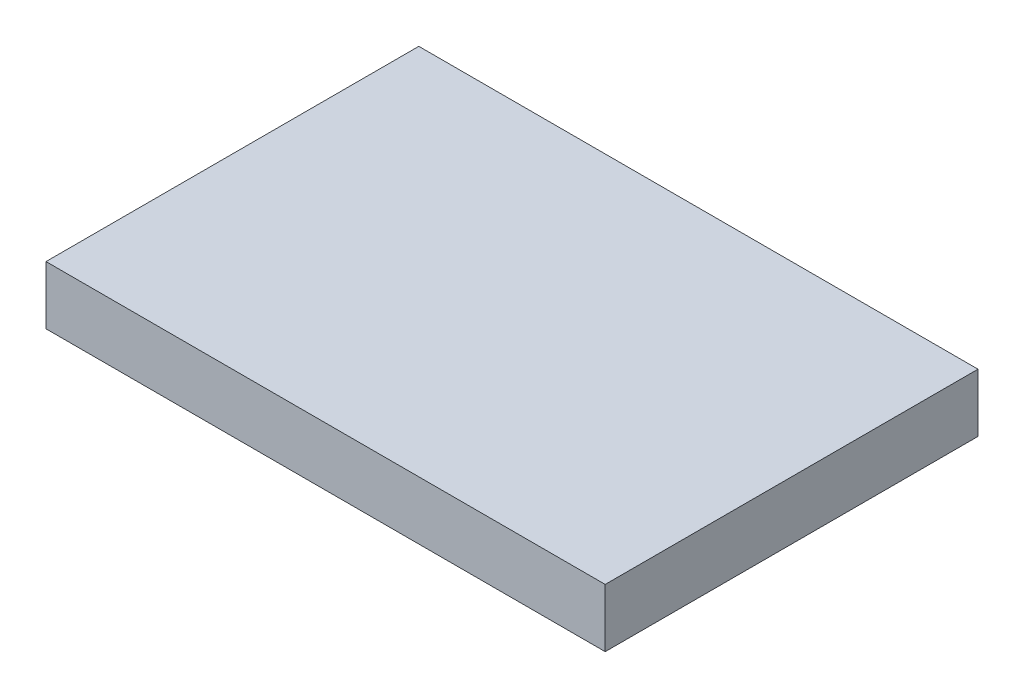
ISO-10303-21;
HEADER;
FILE_DESCRIPTION(('STEP AP214'),'2;1');
FILE_NAME('part.step','',(''),(''),'','','');
FILE_SCHEMA(('AUTOMOTIVE_DESIGN { 1 0 10303 214 1 1 1 1 }'));
ENDSEC;
DATA;
#1=APPLICATION_CONTEXT('core data for automotive mechanical design processes');
#2=APPLICATION_PROTOCOL_DEFINITION('international standard','automotive_design',2000,#1);
#3=PRODUCT_CONTEXT('',#1,'mechanical');
#4=PRODUCT('Part','Part','',(#3));
#5=PRODUCT_RELATED_PRODUCT_CATEGORY('part','',(#4));
#6=PRODUCT_DEFINITION_FORMATION('','',#4);
#7=PRODUCT_DEFINITION_CONTEXT('part definition',#1,'design');
#8=PRODUCT_DEFINITION('design','',#6,#7);
#9=PRODUCT_DEFINITION_SHAPE('','',#8);
#10=(LENGTH_UNIT() NAMED_UNIT(*) SI_UNIT(.MILLI.,.METRE.));
#11=(NAMED_UNIT(*) PLANE_ANGLE_UNIT() SI_UNIT($,.RADIAN.));
#12=(NAMED_UNIT(*) SI_UNIT($,.STERADIAN.) SOLID_ANGLE_UNIT());
#13=UNCERTAINTY_MEASURE_WITH_UNIT(LENGTH_MEASURE(1.E-05),#10,'distance_accuracy_value','');
#14=(GEOMETRIC_REPRESENTATION_CONTEXT(3) GLOBAL_UNCERTAINTY_ASSIGNED_CONTEXT((#13)) GLOBAL_UNIT_ASSIGNED_CONTEXT((#10,
#11,#12)) REPRESENTATION_CONTEXT('',''));
#15=CARTESIAN_POINT('',(0.,0.,0.));
#16=DIRECTION('',(0.,0.,1.));
#17=DIRECTION('',(1.,0.,0.));
#18=AXIS2_PLACEMENT_3D('',#15,#16,#17);
#19=CARTESIAN_POINT('',(0.,1.25,0.));
#20=DIRECTION('',(1.,0.,0.));
#21=DIRECTION('',(0.,0.,-1.));
#22=AXIS2_PLACEMENT_3D('',#19,#20,#21);
#23=PLANE('',#22);
#24=DIRECTION('',(0.,0.,1.));
#25=VECTOR('',#24,1.);
#26=CARTESIAN_POINT('',(0.,0.,0.));
#27=LINE('',#26,#25);
#28=CARTESIAN_POINT('',(0.,0.,-8.));
#29=VERTEX_POINT('',#28);
#30=CARTESIAN_POINT('',(0.,0.,0.));
#31=VERTEX_POINT('',#30);
#32=EDGE_CURVE('E96',#29,#31,#27,.T.);
#33=ORIENTED_EDGE('',*,*,#32,.T.);
#34=DIRECTION('',(0.,-1.,0.));
#35=VECTOR('',#34,1.);
#36=CARTESIAN_POINT('',(0.,1.25,0.));
#37=LINE('',#36,#35);
#38=CARTESIAN_POINT('',(0.,1.25,0.));
#39=VERTEX_POINT('',#38);
#40=EDGE_CURVE('E11',#39,#31,#37,.T.);
#41=ORIENTED_EDGE('',*,*,#40,.F.);
#42=DIRECTION('',(0.,0.,1.));
#43=VECTOR('',#42,1.);
#44=CARTESIAN_POINT('',(0.,1.25,0.));
#45=LINE('',#44,#43);
#46=CARTESIAN_POINT('',(0.,1.25,-8.));
#47=VERTEX_POINT('',#46);
#48=EDGE_CURVE('E84',#47,#39,#45,.T.);
#49=ORIENTED_EDGE('',*,*,#48,.F.);
#50=DIRECTION('',(0.,-1.,0.));
#51=VECTOR('',#50,1.);
#52=CARTESIAN_POINT('',(0.,1.25,-8.));
#53=LINE('',#52,#51);
#54=EDGE_CURVE('E92',#47,#29,#53,.T.);
#55=ORIENTED_EDGE('',*,*,#54,.T.);
#56=EDGE_LOOP('',(#33,#41,#49,#55));
#57=FACE_BOUND('',#56,.T.);
#58=ADVANCED_FACE('F33',(#57),#23,.F.);
#59=CARTESIAN_POINT('',(0.,1.25,0.));
#60=DIRECTION('',(0.,0.,-1.));
#61=DIRECTION('',(-1.,0.,0.));
#62=AXIS2_PLACEMENT_3D('',#59,#60,#61);
#63=PLANE('',#62);
#64=DIRECTION('',(1.,0.,0.));
#65=VECTOR('',#64,1.);
#66=CARTESIAN_POINT('',(0.,0.,0.));
#67=LINE('',#66,#65);
#68=CARTESIAN_POINT('',(12.,0.,0.));
#69=VERTEX_POINT('',#68);
#70=EDGE_CURVE('E88',#31,#69,#67,.T.);
#71=ORIENTED_EDGE('',*,*,#70,.T.);
#72=DIRECTION('',(0.,-1.,0.));
#73=VECTOR('',#72,1.);
#74=CARTESIAN_POINT('',(12.,1.25,0.));
#75=LINE('',#74,#73);
#76=CARTESIAN_POINT('',(12.,1.25,0.));
#77=VERTEX_POINT('',#76);
#78=EDGE_CURVE('E41',#77,#69,#75,.T.);
#79=ORIENTED_EDGE('',*,*,#78,.F.);
#80=DIRECTION('',(1.,0.,0.));
#81=VECTOR('',#80,1.);
#82=CARTESIAN_POINT('',(0.,1.25,0.));
#83=LINE('',#82,#81);
#84=EDGE_CURVE('E79',#39,#77,#83,.T.);
#85=ORIENTED_EDGE('',*,*,#84,.F.);
#86=ORIENTED_EDGE('',*,*,#40,.T.);
#87=EDGE_LOOP('',(#71,#79,#85,#86));
#88=FACE_BOUND('',#87,.T.);
#89=ADVANCED_FACE('F87',(#88),#63,.F.);
#90=CARTESIAN_POINT('',(12.,1.25,0.));
#91=DIRECTION('',(-1.,0.,0.));
#92=DIRECTION('',(0.,0.,1.));
#93=AXIS2_PLACEMENT_3D('',#90,#91,#92);
#94=PLANE('',#93);
#95=DIRECTION('',(0.,0.,-1.));
#96=VECTOR('',#95,1.);
#97=CARTESIAN_POINT('',(12.,0.,0.));
#98=LINE('',#97,#96);
#99=CARTESIAN_POINT('',(12.,0.,-8.));
#100=VERTEX_POINT('',#99);
#101=EDGE_CURVE('E66',#69,#100,#98,.T.);
#102=ORIENTED_EDGE('',*,*,#101,.T.);
#103=DIRECTION('',(0.,-1.,0.));
#104=VECTOR('',#103,1.);
#105=CARTESIAN_POINT('',(12.,1.25,-8.));
#106=LINE('',#105,#104);
#107=CARTESIAN_POINT('',(12.,1.25,-8.));
#108=VERTEX_POINT('',#107);
#109=EDGE_CURVE('E89',#108,#100,#106,.T.);
#110=ORIENTED_EDGE('',*,*,#109,.F.);
#111=DIRECTION('',(0.,0.,-1.));
#112=VECTOR('',#111,1.);
#113=CARTESIAN_POINT('',(12.,1.25,0.));
#114=LINE('',#113,#112);
#115=EDGE_CURVE('E82',#77,#108,#114,.T.);
#116=ORIENTED_EDGE('',*,*,#115,.F.);
#117=ORIENTED_EDGE('',*,*,#78,.T.);
#118=EDGE_LOOP('',(#102,#110,#116,#117));
#119=FACE_BOUND('',#118,.T.);
#120=ADVANCED_FACE('F90',(#119),#94,.F.);
#121=CARTESIAN_POINT('',(0.,1.25,-8.));
#122=DIRECTION('',(0.,0.,1.));
#123=DIRECTION('',(1.,0.,0.));
#124=AXIS2_PLACEMENT_3D('',#121,#122,#123);
#125=PLANE('',#124);
#126=DIRECTION('',(-1.,0.,0.));
#127=VECTOR('',#126,1.);
#128=CARTESIAN_POINT('',(0.,0.,-8.));
#129=LINE('',#128,#127);
#130=EDGE_CURVE('E72',#100,#29,#129,.T.);
#131=ORIENTED_EDGE('',*,*,#130,.T.);
#132=ORIENTED_EDGE('',*,*,#54,.F.);
#133=DIRECTION('',(-1.,0.,0.));
#134=VECTOR('',#133,1.);
#135=CARTESIAN_POINT('',(0.,1.25,-8.));
#136=LINE('',#135,#134);
#137=EDGE_CURVE('E49',#108,#47,#136,.T.);
#138=ORIENTED_EDGE('',*,*,#137,.F.);
#139=ORIENTED_EDGE('',*,*,#109,.T.);
#140=EDGE_LOOP('',(#131,#132,#138,#139));
#141=FACE_BOUND('',#140,.T.);
#142=ADVANCED_FACE('F103',(#141),#125,.F.);
#143=CARTESIAN_POINT('',(0.,1.25,0.));
#144=DIRECTION('',(0.,-1.,0.));
#145=DIRECTION('',(0.,0.,-1.));
#146=AXIS2_PLACEMENT_3D('',#143,#144,#145);
#147=PLANE('',#146);
#148=ORIENTED_EDGE('',*,*,#48,.T.);
#149=ORIENTED_EDGE('',*,*,#84,.T.);
#150=ORIENTED_EDGE('',*,*,#115,.T.);
#151=ORIENTED_EDGE('',*,*,#137,.T.);
#152=EDGE_LOOP('',(#148,#149,#150,#151));
#153=FACE_BOUND('',#152,.T.);
#154=ADVANCED_FACE('F80',(#153),#147,.F.);
#155=CARTESIAN_POINT('',(0.,0.,0.));
#156=DIRECTION('',(0.,-1.,0.));
#157=DIRECTION('',(0.,0.,-1.));
#158=AXIS2_PLACEMENT_3D('',#155,#156,#157);
#159=PLANE('',#158);
#160=ORIENTED_EDGE('',*,*,#32,.F.);
#161=ORIENTED_EDGE('',*,*,#130,.F.);
#162=ORIENTED_EDGE('',*,*,#101,.F.);
#163=ORIENTED_EDGE('',*,*,#70,.F.);
#164=EDGE_LOOP('',(#160,#161,#162,#163));
#165=FACE_BOUND('',#164,.T.);
#166=ADVANCED_FACE('F106',(#165),#159,.T.);
#167=CLOSED_SHELL('',(#58,#89,#120,#142,#154,#166));
#168=MANIFOLD_SOLID_BREP('B2',#167);
#169=ADVANCED_BREP_SHAPE_REPRESENTATION('',(#18,#168),#14);
#170=SHAPE_DEFINITION_REPRESENTATION(#9,#169);
ENDSEC;
END-ISO-10303-21;
